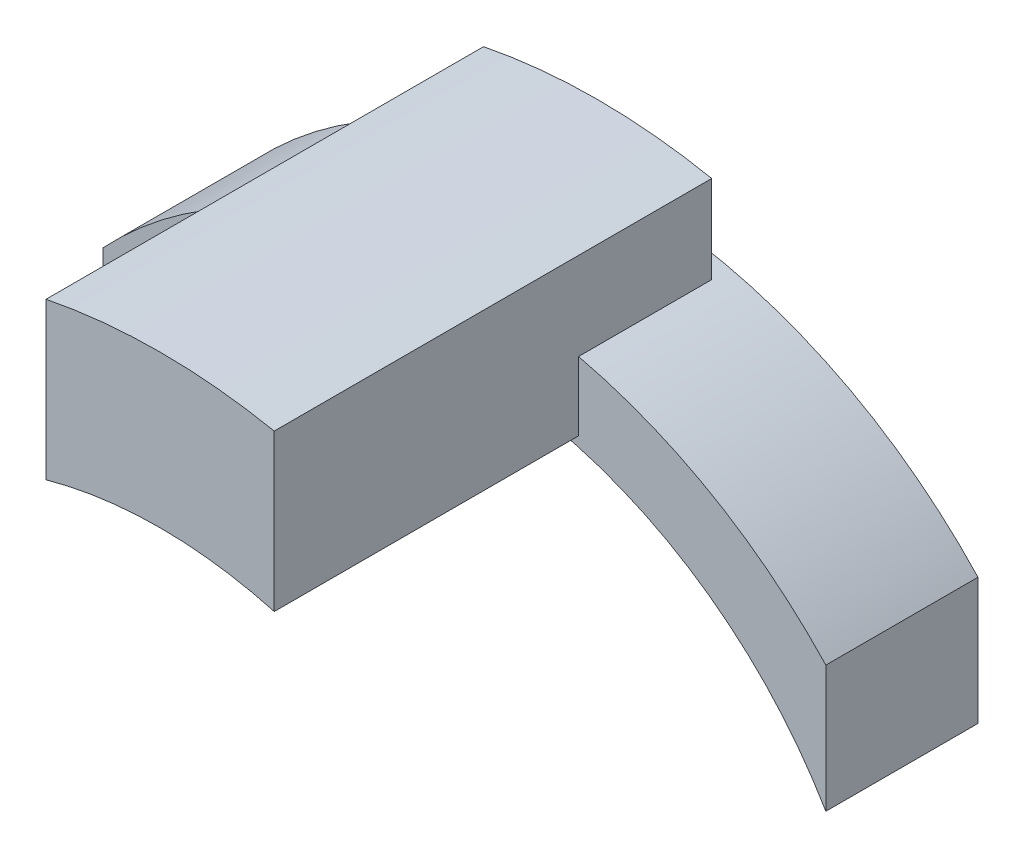
ISO-10303-21;
HEADER;
FILE_DESCRIPTION(('STEP AP214'),'2;1');
FILE_NAME('part.step','',(''),(''),'','','');
FILE_SCHEMA(('AUTOMOTIVE_DESIGN { 1 0 10303 214 1 1 1 1 }'));
ENDSEC;
DATA;
#1=APPLICATION_CONTEXT('core data for automotive mechanical design processes');
#2=APPLICATION_PROTOCOL_DEFINITION('international standard','automotive_design',2000,#1);
#3=PRODUCT_CONTEXT('',#1,'mechanical');
#4=PRODUCT('Part','Part','',(#3));
#5=PRODUCT_RELATED_PRODUCT_CATEGORY('part','',(#4));
#6=PRODUCT_DEFINITION_FORMATION('','',#4);
#7=PRODUCT_DEFINITION_CONTEXT('part definition',#1,'design');
#8=PRODUCT_DEFINITION('design','',#6,#7);
#9=PRODUCT_DEFINITION_SHAPE('','',#8);
#10=(LENGTH_UNIT() NAMED_UNIT(*) SI_UNIT(.MILLI.,.METRE.));
#11=(NAMED_UNIT(*) PLANE_ANGLE_UNIT() SI_UNIT($,.RADIAN.));
#12=(NAMED_UNIT(*) SI_UNIT($,.STERADIAN.) SOLID_ANGLE_UNIT());
#13=UNCERTAINTY_MEASURE_WITH_UNIT(LENGTH_MEASURE(1.E-05),#10,'distance_accuracy_value','');
#14=(GEOMETRIC_REPRESENTATION_CONTEXT(3) GLOBAL_UNCERTAINTY_ASSIGNED_CONTEXT((#13)) GLOBAL_UNIT_ASSIGNED_CONTEXT((#10,
#11,#12)) REPRESENTATION_CONTEXT('',''));
#15=CARTESIAN_POINT('',(0.,0.,0.));
#16=DIRECTION('',(0.,0.,1.));
#17=DIRECTION('',(1.,0.,0.));
#18=AXIS2_PLACEMENT_3D('',#15,#16,#17);
#19=CARTESIAN_POINT('',(0.,0.,4.));
#20=DIRECTION('',(0.,0.,-1.));
#21=DIRECTION('',(-1.,0.,0.));
#22=AXIS2_PLACEMENT_3D('',#19,#20,#21);
#23=CYLINDRICAL_SURFACE('',#22,26.);
#24=DIRECTION('',(0.,0.,-1.));
#25=VECTOR('',#24,1.);
#26=CARTESIAN_POINT('',(-5.99999999999997,25.298221281347,4.));
#27=LINE('',#26,#25);
#28=CARTESIAN_POINT('',(-5.99999999999997,25.298221281347,-3.));
#29=VERTEX_POINT('',#28);
#30=CARTESIAN_POINT('',(-5.99999999999997,25.298221281347,4.));
#31=VERTEX_POINT('',#30);
#32=EDGE_CURVE('E183',#29,#31,#27,.F.);
#33=ORIENTED_EDGE('',*,*,#32,.F.);
#34=CARTESIAN_POINT('',(0.,0.,-3.));
#35=DIRECTION('',(0.,0.,-1.));
#36=DIRECTION('',(-1.,0.,0.));
#37=AXIS2_PLACEMENT_3D('',#34,#35,#36);
#38=CIRCLE('',#37,26.);
#39=CARTESIAN_POINT('',(6.00000000000003,25.298221281347,-3.));
#40=VERTEX_POINT('',#39);
#41=EDGE_CURVE('E11',#29,#40,#38,.T.);
#42=ORIENTED_EDGE('',*,*,#41,.T.);
#43=DIRECTION('',(0.,0.,-1.));
#44=VECTOR('',#43,1.);
#45=CARTESIAN_POINT('',(6.00000000000003,25.298221281347,4.));
#46=LINE('',#45,#44);
#47=CARTESIAN_POINT('',(6.00000000000003,25.298221281347,4.));
#48=VERTEX_POINT('',#47);
#49=EDGE_CURVE('E142',#48,#40,#46,.T.);
#50=ORIENTED_EDGE('',*,*,#49,.F.);
#51=CARTESIAN_POINT('',(0.,0.,4.));
#52=DIRECTION('',(0.,0.,1.));
#53=DIRECTION('',(1.,0.,0.));
#54=AXIS2_PLACEMENT_3D('',#51,#52,#53);
#55=CIRCLE('',#54,26.);
#56=CARTESIAN_POINT('',(19.,17.7482393492988,4.));
#57=VERTEX_POINT('',#56);
#58=EDGE_CURVE('E193',#57,#48,#55,.T.);
#59=ORIENTED_EDGE('',*,*,#58,.F.);
#60=DIRECTION('',(0.,0.,-1.));
#61=VECTOR('',#60,1.);
#62=CARTESIAN_POINT('',(19.,17.7482393492988,4.));
#63=LINE('',#62,#61);
#64=CARTESIAN_POINT('',(19.,17.7482393492988,-4.));
#65=VERTEX_POINT('',#64);
#66=EDGE_CURVE('E216',#57,#65,#63,.T.);
#67=ORIENTED_EDGE('',*,*,#66,.T.);
#68=CARTESIAN_POINT('',(0.,0.,-4.));
#69=DIRECTION('',(0.,0.,1.));
#70=DIRECTION('',(1.,0.,0.));
#71=AXIS2_PLACEMENT_3D('',#68,#69,#70);
#72=CIRCLE('',#71,26.);
#73=CARTESIAN_POINT('',(-19.,17.7482393492988,-4.));
#74=VERTEX_POINT('',#73);
#75=EDGE_CURVE('E206',#65,#74,#72,.T.);
#76=ORIENTED_EDGE('',*,*,#75,.T.);
#77=DIRECTION('',(0.,0.,-1.));
#78=VECTOR('',#77,1.);
#79=CARTESIAN_POINT('',(-19.,17.7482393492988,4.));
#80=LINE('',#79,#78);
#81=CARTESIAN_POINT('',(-19.,17.7482393492988,4.));
#82=VERTEX_POINT('',#81);
#83=EDGE_CURVE('E213',#82,#74,#80,.T.);
#84=ORIENTED_EDGE('',*,*,#83,.F.);
#85=EDGE_CURVE('E192',#31,#82,#55,.T.);
#86=ORIENTED_EDGE('',*,*,#85,.F.);
#87=EDGE_LOOP('',(#33,#42,#50,#59,#67,#76,#84,#86));
#88=FACE_BOUND('',#87,.T.);
#89=ADVANCED_FACE('F43',(#88),#23,.T.);
#90=CARTESIAN_POINT('',(0.,0.,4.));
#91=DIRECTION('',(0.,0.,1.));
#92=DIRECTION('',(1.,0.,0.));
#93=AXIS2_PLACEMENT_3D('',#90,#91,#92);
#94=PLANE('',#93);
#95=CARTESIAN_POINT('',(0.,0.,4.));
#96=DIRECTION('',(0.,0.,1.));
#97=DIRECTION('',(1.,0.,0.));
#98=AXIS2_PLACEMENT_3D('',#95,#96,#97);
#99=CIRCLE('',#98,22.5);
#100=CARTESIAN_POINT('',(6.00000000000002,21.6852484422015,4.));
#101=VERTEX_POINT('',#100);
#102=CARTESIAN_POINT('',(-5.99999999999998,21.6852484422015,4.));
#103=VERTEX_POINT('',#102);
#104=EDGE_CURVE('E227',#101,#103,#99,.T.);
#105=ORIENTED_EDGE('',*,*,#104,.T.);
#106=DIRECTION('',(0.,1.,0.));
#107=VECTOR('',#106,1.);
#108=CARTESIAN_POINT('',(-6.00000000000003,0.,4.));
#109=LINE('',#108,#107);
#110=EDGE_CURVE('E52',#103,#31,#109,.T.);
#111=ORIENTED_EDGE('',*,*,#110,.T.);
#112=ORIENTED_EDGE('',*,*,#85,.T.);
#113=DIRECTION('',(0.,-1.,0.));
#114=VECTOR('',#113,1.);
#115=CARTESIAN_POINT('',(-19.,11.0905365064094,4.));
#116=LINE('',#115,#114);
#117=CARTESIAN_POINT('',(-19.,11.0905365064094,4.));
#118=VERTEX_POINT('',#117);
#119=EDGE_CURVE('E68',#82,#118,#116,.T.);
#120=ORIENTED_EDGE('',*,*,#119,.T.);
#121=CARTESIAN_POINT('',(0.,0.,4.));
#122=DIRECTION('',(0.,0.,-1.));
#123=DIRECTION('',(1.,0.,0.));
#124=AXIS2_PLACEMENT_3D('',#121,#122,#123);
#125=CIRCLE('',#124,22.);
#126=CARTESIAN_POINT('',(19.,11.0905365064094,4.));
#127=VERTEX_POINT('',#126);
#128=EDGE_CURVE('E187',#118,#127,#125,.T.);
#129=ORIENTED_EDGE('',*,*,#128,.T.);
#130=DIRECTION('',(0.,1.,0.));
#131=VECTOR('',#130,1.);
#132=CARTESIAN_POINT('',(19.,17.7482393492988,4.));
#133=LINE('',#132,#131);
#134=EDGE_CURVE('E97',#127,#57,#133,.T.);
#135=ORIENTED_EDGE('',*,*,#134,.T.);
#136=ORIENTED_EDGE('',*,*,#58,.T.);
#137=DIRECTION('',(0.,-1.,0.));
#138=VECTOR('',#137,1.);
#139=CARTESIAN_POINT('',(5.99999999999997,0.,4.));
#140=LINE('',#139,#138);
#141=EDGE_CURVE('E223',#48,#101,#140,.T.);
#142=ORIENTED_EDGE('',*,*,#141,.T.);
#143=EDGE_LOOP('',(#105,#111,#112,#120,#129,#135,#136,#142));
#144=FACE_BOUND('',#143,.T.);
#145=ADVANCED_FACE('F231',(#144),#94,.T.);
#146=CARTESIAN_POINT('',(0.,0.,4.));
#147=DIRECTION('',(0.,0.,-1.));
#148=DIRECTION('',(-1.,0.,0.));
#149=AXIS2_PLACEMENT_3D('',#146,#147,#148);
#150=CYLINDRICAL_SURFACE('',#149,22.);
#151=CARTESIAN_POINT('',(0.,0.,-4.));
#152=DIRECTION('',(0.,0.,-1.));
#153=DIRECTION('',(1.,0.,0.));
#154=AXIS2_PLACEMENT_3D('',#151,#152,#153);
#155=CIRCLE('',#154,22.);
#156=CARTESIAN_POINT('',(-19.,11.0905365064094,-4.));
#157=VERTEX_POINT('',#156);
#158=CARTESIAN_POINT('',(19.,11.0905365064094,-4.));
#159=VERTEX_POINT('',#158);
#160=EDGE_CURVE('E186',#157,#159,#155,.T.);
#161=ORIENTED_EDGE('',*,*,#160,.T.);
#162=DIRECTION('',(0.,0.,-1.));
#163=VECTOR('',#162,1.);
#164=CARTESIAN_POINT('',(19.,11.0905365064094,4.));
#165=LINE('',#164,#163);
#166=EDGE_CURVE('E220',#127,#159,#165,.T.);
#167=ORIENTED_EDGE('',*,*,#166,.F.);
#168=ORIENTED_EDGE('',*,*,#128,.F.);
#169=DIRECTION('',(0.,0.,-1.));
#170=VECTOR('',#169,1.);
#171=CARTESIAN_POINT('',(-19.,11.0905365064094,4.));
#172=LINE('',#171,#170);
#173=EDGE_CURVE('E199',#118,#157,#172,.T.);
#174=ORIENTED_EDGE('',*,*,#173,.T.);
#175=EDGE_LOOP('',(#161,#167,#168,#174));
#176=FACE_BOUND('',#175,.T.);
#177=ADVANCED_FACE('F45',(#176),#150,.F.);
#178=CARTESIAN_POINT('',(19.,17.7482393492988,4.));
#179=DIRECTION('',(-1.,0.,0.));
#180=DIRECTION('',(0.,0.,1.));
#181=AXIS2_PLACEMENT_3D('',#178,#179,#180);
#182=PLANE('',#181);
#183=DIRECTION('',(0.,1.,0.));
#184=VECTOR('',#183,1.);
#185=CARTESIAN_POINT('',(19.,17.7482393492988,-4.));
#186=LINE('',#185,#184);
#187=EDGE_CURVE('E203',#159,#65,#186,.T.);
#188=ORIENTED_EDGE('',*,*,#187,.T.);
#189=ORIENTED_EDGE('',*,*,#66,.F.);
#190=ORIENTED_EDGE('',*,*,#134,.F.);
#191=ORIENTED_EDGE('',*,*,#166,.T.);
#192=EDGE_LOOP('',(#188,#189,#190,#191));
#193=FACE_BOUND('',#192,.T.);
#194=ADVANCED_FACE('F243',(#193),#182,.F.);
#195=CARTESIAN_POINT('',(-19.,11.0905365064094,4.));
#196=DIRECTION('',(1.,0.,0.));
#197=DIRECTION('',(0.,0.,-1.));
#198=AXIS2_PLACEMENT_3D('',#195,#196,#197);
#199=PLANE('',#198);
#200=DIRECTION('',(0.,-1.,0.));
#201=VECTOR('',#200,1.);
#202=CARTESIAN_POINT('',(-19.,11.0905365064094,-4.));
#203=LINE('',#202,#201);
#204=EDGE_CURVE('E89',#74,#157,#203,.T.);
#205=ORIENTED_EDGE('',*,*,#204,.T.);
#206=ORIENTED_EDGE('',*,*,#173,.F.);
#207=ORIENTED_EDGE('',*,*,#119,.F.);
#208=ORIENTED_EDGE('',*,*,#83,.T.);
#209=EDGE_LOOP('',(#205,#206,#207,#208));
#210=FACE_BOUND('',#209,.T.);
#211=ADVANCED_FACE('F237',(#210),#199,.F.);
#212=CARTESIAN_POINT('',(0.,0.,-4.));
#213=DIRECTION('',(0.,0.,1.));
#214=DIRECTION('',(1.,0.,0.));
#215=AXIS2_PLACEMENT_3D('',#212,#213,#214);
#216=PLANE('',#215);
#217=ORIENTED_EDGE('',*,*,#160,.F.);
#218=ORIENTED_EDGE('',*,*,#204,.F.);
#219=ORIENTED_EDGE('',*,*,#75,.F.);
#220=ORIENTED_EDGE('',*,*,#187,.F.);
#221=EDGE_LOOP('',(#217,#218,#219,#220));
#222=FACE_BOUND('',#221,.T.);
#223=ADVANCED_FACE('F276',(#222),#216,.F.);
#224=CARTESIAN_POINT('',(0.,0.,-3.));
#225=DIRECTION('',(0.,0.,-1.));
#226=DIRECTION('',(-1.,0.,0.));
#227=AXIS2_PLACEMENT_3D('',#224,#225,#226);
#228=PLANE('',#227);
#229=ORIENTED_EDGE('',*,*,#41,.F.);
#230=DIRECTION('',(0.,1.,0.));
#231=VECTOR('',#230,1.);
#232=CARTESIAN_POINT('',(-5.99999999999998,21.6852484422015,-3.));
#233=LINE('',#232,#231);
#234=CARTESIAN_POINT('',(-5.99999999999996,29.9040131086114,-3.));
#235=VERTEX_POINT('',#234);
#236=EDGE_CURVE('E164',#29,#235,#233,.T.);
#237=ORIENTED_EDGE('',*,*,#236,.T.);
#238=CARTESIAN_POINT('',(0.,0.,-3.));
#239=DIRECTION('',(0.,0.,-1.));
#240=DIRECTION('',(-1.,0.,0.));
#241=AXIS2_PLACEMENT_3D('',#238,#239,#240);
#242=CIRCLE('',#241,30.5);
#243=CARTESIAN_POINT('',(6.00000000000004,29.9040131086113,-3.));
#244=VERTEX_POINT('',#243);
#245=EDGE_CURVE('E167',#235,#244,#242,.T.);
#246=ORIENTED_EDGE('',*,*,#245,.T.);
#247=DIRECTION('',(0.,-1.,0.));
#248=VECTOR('',#247,1.);
#249=CARTESIAN_POINT('',(6.00000000000004,29.9040131086113,-3.));
#250=LINE('',#249,#248);
#251=EDGE_CURVE('E170',#244,#40,#250,.T.);
#252=ORIENTED_EDGE('',*,*,#251,.T.);
#253=EDGE_LOOP('',(#229,#237,#246,#252));
#254=FACE_BOUND('',#253,.T.);
#255=ADVANCED_FACE('F248',(#254),#228,.T.);
#256=CARTESIAN_POINT('',(-5.99999999999998,21.6852484422015,-3.));
#257=DIRECTION('',(1.,0.,0.));
#258=DIRECTION('',(0.,1.,0.));
#259=AXIS2_PLACEMENT_3D('',#256,#257,#258);
#260=PLANE('',#259);
#261=ORIENTED_EDGE('',*,*,#236,.F.);
#262=ORIENTED_EDGE('',*,*,#32,.T.);
#263=ORIENTED_EDGE('',*,*,#110,.F.);
#264=DIRECTION('',(0.,0.,1.));
#265=VECTOR('',#264,1.);
#266=CARTESIAN_POINT('',(-5.99999999999998,21.6852484422015,-3.));
#267=LINE('',#266,#265);
#268=CARTESIAN_POINT('',(-5.99999999999998,21.6852484422015,20.));
#269=VERTEX_POINT('',#268);
#270=EDGE_CURVE('E131',#103,#269,#267,.T.);
#271=ORIENTED_EDGE('',*,*,#270,.T.);
#272=DIRECTION('',(0.,1.,0.));
#273=VECTOR('',#272,1.);
#274=CARTESIAN_POINT('',(-5.99999999999998,21.6852484422015,20.));
#275=LINE('',#274,#273);
#276=CARTESIAN_POINT('',(-5.99999999999996,29.9040131086114,20.));
#277=VERTEX_POINT('',#276);
#278=EDGE_CURVE('E136',#269,#277,#275,.T.);
#279=ORIENTED_EDGE('',*,*,#278,.T.);
#280=DIRECTION('',(0.,0.,1.));
#281=VECTOR('',#280,1.);
#282=CARTESIAN_POINT('',(-5.99999999999996,29.9040131086114,-3.));
#283=LINE('',#282,#281);
#284=EDGE_CURVE('E143',#235,#277,#283,.T.);
#285=ORIENTED_EDGE('',*,*,#284,.F.);
#286=EDGE_LOOP('',(#261,#262,#263,#271,#279,#285));
#287=FACE_BOUND('',#286,.T.);
#288=ADVANCED_FACE('F134',(#287),#260,.F.);
#289=CARTESIAN_POINT('',(6.00000000000004,29.9040131086113,-3.));
#290=DIRECTION('',(-1.,0.,0.));
#291=DIRECTION('',(0.,-1.,0.));
#292=AXIS2_PLACEMENT_3D('',#289,#290,#291);
#293=PLANE('',#292);
#294=ORIENTED_EDGE('',*,*,#141,.F.);
#295=ORIENTED_EDGE('',*,*,#49,.T.);
#296=ORIENTED_EDGE('',*,*,#251,.F.);
#297=DIRECTION('',(0.,0.,1.));
#298=VECTOR('',#297,1.);
#299=CARTESIAN_POINT('',(6.00000000000004,29.9040131086113,-3.));
#300=LINE('',#299,#298);
#301=CARTESIAN_POINT('',(6.00000000000004,29.9040131086113,20.));
#302=VERTEX_POINT('',#301);
#303=EDGE_CURVE('E176',#244,#302,#300,.T.);
#304=ORIENTED_EDGE('',*,*,#303,.T.);
#305=DIRECTION('',(0.,-1.,0.));
#306=VECTOR('',#305,1.);
#307=CARTESIAN_POINT('',(6.00000000000004,29.9040131086113,20.));
#308=LINE('',#307,#306);
#309=CARTESIAN_POINT('',(6.00000000000002,21.6852484422015,20.));
#310=VERTEX_POINT('',#309);
#311=EDGE_CURVE('E161',#302,#310,#308,.T.);
#312=ORIENTED_EDGE('',*,*,#311,.T.);
#313=DIRECTION('',(0.,0.,1.));
#314=VECTOR('',#313,1.);
#315=CARTESIAN_POINT('',(6.00000000000002,21.6852484422015,-3.));
#316=LINE('',#315,#314);
#317=EDGE_CURVE('E59',#101,#310,#316,.T.);
#318=ORIENTED_EDGE('',*,*,#317,.F.);
#319=EDGE_LOOP('',(#294,#295,#296,#304,#312,#318));
#320=FACE_BOUND('',#319,.T.);
#321=ADVANCED_FACE('F246',(#320),#293,.F.);
#322=CARTESIAN_POINT('',(0.,0.,-3.));
#323=DIRECTION('',(0.,0.,1.));
#324=DIRECTION('',(1.,0.,0.));
#325=AXIS2_PLACEMENT_3D('',#322,#323,#324);
#326=CYLINDRICAL_SURFACE('',#325,22.5);
#327=ORIENTED_EDGE('',*,*,#104,.F.);
#328=ORIENTED_EDGE('',*,*,#317,.T.);
#329=CARTESIAN_POINT('',(0.,0.,20.));
#330=DIRECTION('',(0.,0.,1.));
#331=DIRECTION('',(-1.,0.,0.));
#332=AXIS2_PLACEMENT_3D('',#329,#330,#331);
#333=CIRCLE('',#332,22.5);
#334=EDGE_CURVE('E150',#310,#269,#333,.T.);
#335=ORIENTED_EDGE('',*,*,#334,.T.);
#336=ORIENTED_EDGE('',*,*,#270,.F.);
#337=EDGE_LOOP('',(#327,#328,#335,#336));
#338=FACE_BOUND('',#337,.T.);
#339=ADVANCED_FACE('F155',(#338),#326,.F.);
#340=CARTESIAN_POINT('',(0.,0.,-3.));
#341=DIRECTION('',(0.,0.,1.));
#342=DIRECTION('',(1.,0.,0.));
#343=AXIS2_PLACEMENT_3D('',#340,#341,#342);
#344=CYLINDRICAL_SURFACE('',#343,30.5);
#345=ORIENTED_EDGE('',*,*,#284,.T.);
#346=CARTESIAN_POINT('',(0.,0.,20.));
#347=DIRECTION('',(0.,0.,-1.));
#348=DIRECTION('',(-1.,0.,0.));
#349=AXIS2_PLACEMENT_3D('',#346,#347,#348);
#350=CIRCLE('',#349,30.5);
#351=EDGE_CURVE('E152',#277,#302,#350,.T.);
#352=ORIENTED_EDGE('',*,*,#351,.T.);
#353=ORIENTED_EDGE('',*,*,#303,.F.);
#354=ORIENTED_EDGE('',*,*,#245,.F.);
#355=EDGE_LOOP('',(#345,#352,#353,#354));
#356=FACE_BOUND('',#355,.T.);
#357=ADVANCED_FACE('F252',(#356),#344,.T.);
#358=CARTESIAN_POINT('',(0.,0.,20.));
#359=DIRECTION('',(0.,0.,-1.));
#360=DIRECTION('',(-1.,0.,0.));
#361=AXIS2_PLACEMENT_3D('',#358,#359,#360);
#362=PLANE('',#361);
#363=ORIENTED_EDGE('',*,*,#334,.F.);
#364=ORIENTED_EDGE('',*,*,#311,.F.);
#365=ORIENTED_EDGE('',*,*,#351,.F.);
#366=ORIENTED_EDGE('',*,*,#278,.F.);
#367=EDGE_LOOP('',(#363,#364,#365,#366));
#368=FACE_BOUND('',#367,.T.);
#369=ADVANCED_FACE('F148',(#368),#362,.F.);
#370=CLOSED_SHELL('',(#89,#145,#177,#194,#211,#223,#255,#288,#321,#339,#357,#369));
#371=MANIFOLD_SOLID_BREP('B2',#370);
#372=ADVANCED_BREP_SHAPE_REPRESENTATION('',(#18,#371),#14);
#373=SHAPE_DEFINITION_REPRESENTATION(#9,#372);
ENDSEC;
END-ISO-10303-21;
